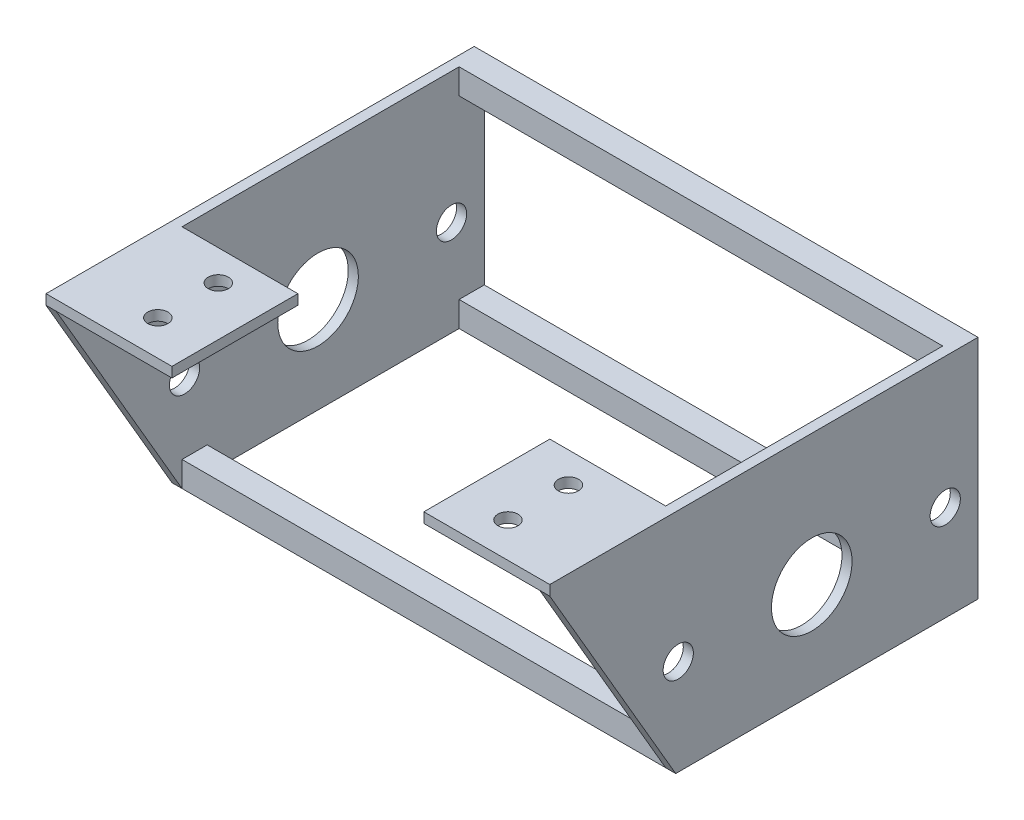
ISO-10303-21;
HEADER;
FILE_DESCRIPTION(('STEP AP214'),'2;1');
FILE_NAME('part.step','',(''),(''),'','','');
FILE_SCHEMA(('AUTOMOTIVE_DESIGN { 1 0 10303 214 1 1 1 1 }'));
ENDSEC;
DATA;
#1=APPLICATION_CONTEXT('core data for automotive mechanical design processes');
#2=APPLICATION_PROTOCOL_DEFINITION('international standard','automotive_design',2000,#1);
#3=PRODUCT_CONTEXT('',#1,'mechanical');
#4=PRODUCT('Part','Part','',(#3));
#5=PRODUCT_RELATED_PRODUCT_CATEGORY('part','',(#4));
#6=PRODUCT_DEFINITION_FORMATION('','',#4);
#7=PRODUCT_DEFINITION_CONTEXT('part definition',#1,'design');
#8=PRODUCT_DEFINITION('design','',#6,#7);
#9=PRODUCT_DEFINITION_SHAPE('','',#8);
#10=(LENGTH_UNIT() NAMED_UNIT(*) SI_UNIT(.MILLI.,.METRE.));
#11=(NAMED_UNIT(*) PLANE_ANGLE_UNIT() SI_UNIT($,.RADIAN.));
#12=(NAMED_UNIT(*) SI_UNIT($,.STERADIAN.) SOLID_ANGLE_UNIT());
#13=UNCERTAINTY_MEASURE_WITH_UNIT(LENGTH_MEASURE(1.E-05),#10,'distance_accuracy_value','');
#14=(GEOMETRIC_REPRESENTATION_CONTEXT(3) GLOBAL_UNCERTAINTY_ASSIGNED_CONTEXT((#13)) GLOBAL_UNIT_ASSIGNED_CONTEXT((#10,
#11,#12)) REPRESENTATION_CONTEXT('',''));
#15=CARTESIAN_POINT('',(0.,0.,0.));
#16=DIRECTION('',(0.,0.,1.));
#17=DIRECTION('',(1.,0.,0.));
#18=AXIS2_PLACEMENT_3D('',#15,#16,#17);
#19=CARTESIAN_POINT('',(50.,-22.5,60.));
#20=DIRECTION('',(0.,0.502620457374531,-0.864507186684193));
#21=DIRECTION('',(0.,0.864507186684193,0.502620457374531));
#22=AXIS2_PLACEMENT_3D('',#19,#20,#21);
#23=PLANE('',#22);
#24=DIRECTION('',(-1.,0.,0.));
#25=VECTOR('',#24,1.);
#26=CARTESIAN_POINT('',(50.,-22.5,60.));
#27=LINE('',#26,#25);
#28=CARTESIAN_POINT('',(-48.,-22.5,60.));
#29=VERTEX_POINT('',#28);
#30=CARTESIAN_POINT('',(-50.,-22.5,60.));
#31=VERTEX_POINT('',#30);
#32=EDGE_CURVE('E342',#29,#31,#27,.T.);
#33=ORIENTED_EDGE('',*,*,#32,.F.);
#34=DIRECTION('',(0.,0.864507186684193,0.502620457374531));
#35=VECTOR('',#34,1.);
#36=CARTESIAN_POINT('',(-48.,-22.5,60.));
#37=LINE('',#36,#35);
#38=CARTESIAN_POINT('',(-48.,20.5,85.));
#39=VERTEX_POINT('',#38);
#40=EDGE_CURVE('E300',#29,#39,#37,.T.);
#41=ORIENTED_EDGE('',*,*,#40,.T.);
#42=DIRECTION('',(-1.,0.,0.));
#43=VECTOR('',#42,1.);
#44=CARTESIAN_POINT('',(50.,20.5,85.));
#45=LINE('',#44,#43);
#46=CARTESIAN_POINT('',(-50.,20.5,85.));
#47=VERTEX_POINT('',#46);
#48=EDGE_CURVE('E346',#39,#47,#45,.T.);
#49=ORIENTED_EDGE('',*,*,#48,.T.);
#50=DIRECTION('',(0.,-0.864507186684193,-0.502620457374531));
#51=VECTOR('',#50,1.);
#52=CARTESIAN_POINT('',(-50.,-22.5,60.));
#53=LINE('',#52,#51);
#54=EDGE_CURVE('E330',#47,#31,#53,.T.);
#55=ORIENTED_EDGE('',*,*,#54,.T.);
#56=EDGE_LOOP('',(#33,#41,#49,#55));
#57=FACE_BOUND('',#56,.T.);
#58=ADVANCED_FACE('F38',(#57),#23,.F.);
#59=CARTESIAN_POINT('',(50.,20.5,85.));
#60=DIRECTION('',(0.,0.,-1.));
#61=DIRECTION('',(-1.,0.,0.));
#62=AXIS2_PLACEMENT_3D('',#59,#60,#61);
#63=PLANE('',#62);
#64=DIRECTION('',(-1.,0.,0.));
#65=VECTOR('',#64,1.);
#66=CARTESIAN_POINT('',(50.,22.5,85.));
#67=LINE('',#66,#65);
#68=CARTESIAN_POINT('',(50.,22.5,85.));
#69=VERTEX_POINT('',#68);
#70=CARTESIAN_POINT('',(25.,22.5,85.));
#71=VERTEX_POINT('',#70);
#72=EDGE_CURVE('E347',#69,#71,#67,.T.);
#73=ORIENTED_EDGE('',*,*,#72,.T.);
#74=DIRECTION('',(0.,-1.,0.));
#75=VECTOR('',#74,1.);
#76=CARTESIAN_POINT('',(25.,20.5,85.));
#77=LINE('',#76,#75);
#78=CARTESIAN_POINT('',(25.,20.5,85.));
#79=VERTEX_POINT('',#78);
#80=EDGE_CURVE('E237',#71,#79,#77,.T.);
#81=ORIENTED_EDGE('',*,*,#80,.T.);
#82=DIRECTION('',(1.,0.,0.));
#83=VECTOR('',#82,1.);
#84=CARTESIAN_POINT('',(48.,20.5,85.));
#85=LINE('',#84,#83);
#86=CARTESIAN_POINT('',(48.,20.5,85.));
#87=VERTEX_POINT('',#86);
#88=EDGE_CURVE('E240',#79,#87,#85,.T.);
#89=ORIENTED_EDGE('',*,*,#88,.T.);
#90=CARTESIAN_POINT('',(50.,20.5,85.));
#91=VERTEX_POINT('',#90);
#92=EDGE_CURVE('E343',#91,#87,#45,.T.);
#93=ORIENTED_EDGE('',*,*,#92,.F.);
#94=DIRECTION('',(0.,-1.,0.));
#95=VECTOR('',#94,1.);
#96=CARTESIAN_POINT('',(50.,20.5,85.));
#97=LINE('',#96,#95);
#98=EDGE_CURVE('E326',#69,#91,#97,.T.);
#99=ORIENTED_EDGE('',*,*,#98,.F.);
#100=EDGE_LOOP('',(#73,#81,#89,#93,#99));
#101=FACE_BOUND('',#100,.T.);
#102=ADVANCED_FACE('F400',(#101),#63,.F.);
#103=CARTESIAN_POINT('',(48.,20.5,85.));
#104=DIRECTION('',(0.,1.,0.));
#105=DIRECTION('',(0.,0.,1.));
#106=AXIS2_PLACEMENT_3D('',#103,#104,#105);
#107=PLANE('',#106);
#108=CARTESIAN_POINT('',(34.75,20.5,66.05));
#109=DIRECTION('',(0.,-1.,0.));
#110=DIRECTION('',(0.,0.,-1.));
#111=AXIS2_PLACEMENT_3D('',#108,#109,#110);
#112=CIRCLE('',#111,2.);
#113=CARTESIAN_POINT('',(34.75,20.5,64.05));
#114=VERTEX_POINT('',#113);
#115=EDGE_CURVE('E486',#114,#114,#112,.T.);
#116=ORIENTED_EDGE('',*,*,#115,.F.);
#117=EDGE_LOOP('',(#116));
#118=FACE_BOUND('',#117,.T.);
#119=CARTESIAN_POINT('',(34.75,20.5,78.05));
#120=DIRECTION('',(0.,-1.,0.));
#121=DIRECTION('',(0.,0.,-1.));
#122=AXIS2_PLACEMENT_3D('',#119,#120,#121);
#123=CIRCLE('',#122,2.);
#124=CARTESIAN_POINT('',(34.75,20.5,76.05));
#125=VERTEX_POINT('',#124);
#126=EDGE_CURVE('E489',#125,#125,#123,.T.);
#127=ORIENTED_EDGE('',*,*,#126,.F.);
#128=EDGE_LOOP('',(#127));
#129=FACE_BOUND('',#128,.T.);
#130=DIRECTION('',(0.,0.,-1.));
#131=VECTOR('',#130,1.);
#132=CARTESIAN_POINT('',(25.,20.5,85.));
#133=LINE('',#132,#131);
#134=CARTESIAN_POINT('',(25.,20.5,60.));
#135=VERTEX_POINT('',#134);
#136=EDGE_CURVE('E46',#79,#135,#133,.T.);
#137=ORIENTED_EDGE('',*,*,#136,.T.);
#138=DIRECTION('',(-1.,0.,0.));
#139=VECTOR('',#138,1.);
#140=CARTESIAN_POINT('',(48.,20.5,60.));
#141=LINE('',#140,#139);
#142=CARTESIAN_POINT('',(48.,20.5,60.));
#143=VERTEX_POINT('',#142);
#144=EDGE_CURVE('E462',#143,#135,#141,.T.);
#145=ORIENTED_EDGE('',*,*,#144,.F.);
#146=DIRECTION('',(0.,0.,-1.));
#147=VECTOR('',#146,1.);
#148=CARTESIAN_POINT('',(48.,20.5,85.));
#149=LINE('',#148,#147);
#150=EDGE_CURVE('E243',#87,#143,#149,.T.);
#151=ORIENTED_EDGE('',*,*,#150,.F.);
#152=ORIENTED_EDGE('',*,*,#88,.F.);
#153=EDGE_LOOP('',(#137,#145,#151,#152));
#154=FACE_BOUND('',#153,.T.);
#155=ADVANCED_FACE('F407',(#118,#129,#154),#107,.F.);
#156=CARTESIAN_POINT('',(-48.,-22.5,5.));
#157=DIRECTION('',(0.,0.,-1.));
#158=DIRECTION('',(-1.,0.,0.));
#159=AXIS2_PLACEMENT_3D('',#156,#157,#158);
#160=PLANE('',#159);
#161=DIRECTION('',(0.,1.,0.));
#162=VECTOR('',#161,1.);
#163=CARTESIAN_POINT('',(48.,-22.5,5.));
#164=LINE('',#163,#162);
#165=CARTESIAN_POINT('',(48.,-22.5,5.));
#166=VERTEX_POINT('',#165);
#167=CARTESIAN_POINT('',(48.,-17.5,5.));
#168=VERTEX_POINT('',#167);
#169=EDGE_CURVE('E316',#166,#168,#164,.T.);
#170=ORIENTED_EDGE('',*,*,#169,.T.);
#171=DIRECTION('',(-1.,0.,0.));
#172=VECTOR('',#171,1.);
#173=CARTESIAN_POINT('',(-48.,-17.5,5.));
#174=LINE('',#173,#172);
#175=CARTESIAN_POINT('',(-48.,-17.5,5.));
#176=VERTEX_POINT('',#175);
#177=EDGE_CURVE('E209',#168,#176,#174,.T.);
#178=ORIENTED_EDGE('',*,*,#177,.T.);
#179=DIRECTION('',(0.,1.,0.));
#180=VECTOR('',#179,1.);
#181=CARTESIAN_POINT('',(-48.,-22.5,5.));
#182=LINE('',#181,#180);
#183=CARTESIAN_POINT('',(-48.,-22.5,5.00000000000002));
#184=VERTEX_POINT('',#183);
#185=EDGE_CURVE('E311',#184,#176,#182,.T.);
#186=ORIENTED_EDGE('',*,*,#185,.F.);
#187=DIRECTION('',(-1.,0.,0.));
#188=VECTOR('',#187,1.);
#189=CARTESIAN_POINT('',(-48.,-22.5,5.));
#190=LINE('',#189,#188);
#191=EDGE_CURVE('E305',#166,#184,#190,.T.);
#192=ORIENTED_EDGE('',*,*,#191,.F.);
#193=EDGE_LOOP('',(#170,#178,#186,#192));
#194=FACE_BOUND('',#193,.T.);
#195=ADVANCED_FACE('F533',(#194),#160,.F.);
#196=CARTESIAN_POINT('',(50.,22.5,90.));
#197=DIRECTION('',(-1.,0.,0.));
#198=DIRECTION('',(0.,-1.,0.));
#199=AXIS2_PLACEMENT_3D('',#196,#197,#198);
#200=PLANE('',#199);
#201=CARTESIAN_POINT('',(50.,-3.50000000000018,59.5));
#202=DIRECTION('',(1.,0.,0.));
#203=DIRECTION('',(0.,1.,0.));
#204=AXIS2_PLACEMENT_3D('',#201,#202,#203);
#205=CIRCLE('',#204,3.);
#206=CARTESIAN_POINT('',(50.,-0.500000000000175,59.5));
#207=VERTEX_POINT('',#206);
#208=EDGE_CURVE('E246',#207,#207,#205,.T.);
#209=ORIENTED_EDGE('',*,*,#208,.F.);
#210=EDGE_LOOP('',(#209));
#211=FACE_BOUND('',#210,.T.);
#212=CARTESIAN_POINT('',(50.,-3.49999999999979,6.5));
#213=DIRECTION('',(1.,0.,0.));
#214=DIRECTION('',(0.,1.,0.));
#215=AXIS2_PLACEMENT_3D('',#212,#213,#214);
#216=CIRCLE('',#215,3.);
#217=CARTESIAN_POINT('',(50.,-0.499999999999787,6.5));
#218=VERTEX_POINT('',#217);
#219=EDGE_CURVE('E252',#218,#218,#216,.T.);
#220=ORIENTED_EDGE('',*,*,#219,.F.);
#221=EDGE_LOOP('',(#220));
#222=FACE_BOUND('',#221,.T.);
#223=CARTESIAN_POINT('',(50.,-3.49999999999998,33.));
#224=DIRECTION('',(1.,0.,0.));
#225=DIRECTION('',(0.,1.,0.));
#226=AXIS2_PLACEMENT_3D('',#223,#224,#225);
#227=CIRCLE('',#226,8.);
#228=CARTESIAN_POINT('',(50.,4.50000000000002,33.));
#229=VERTEX_POINT('',#228);
#230=EDGE_CURVE('E251',#229,#229,#227,.T.);
#231=ORIENTED_EDGE('',*,*,#230,.F.);
#232=EDGE_LOOP('',(#231));
#233=FACE_BOUND('',#232,.T.);
#234=ORIENTED_EDGE('',*,*,#98,.T.);
#235=DIRECTION('',(0.,-0.864507186684193,-0.502620457374531));
#236=VECTOR('',#235,1.);
#237=CARTESIAN_POINT('',(50.,-22.5,60.));
#238=LINE('',#237,#236);
#239=CARTESIAN_POINT('',(50.,-22.5,60.));
#240=VERTEX_POINT('',#239);
#241=EDGE_CURVE('E329',#91,#240,#238,.T.);
#242=ORIENTED_EDGE('',*,*,#241,.T.);
#243=DIRECTION('',(0.,0.,-1.));
#244=VECTOR('',#243,1.);
#245=CARTESIAN_POINT('',(50.,-22.5,90.));
#246=LINE('',#245,#244);
#247=CARTESIAN_POINT('',(50.,-22.5,0.));
#248=VERTEX_POINT('',#247);
#249=EDGE_CURVE('E361',#240,#248,#246,.T.);
#250=ORIENTED_EDGE('',*,*,#249,.T.);
#251=DIRECTION('',(0.,1.,0.));
#252=VECTOR('',#251,1.);
#253=CARTESIAN_POINT('',(50.,22.5,0.));
#254=LINE('',#253,#252);
#255=CARTESIAN_POINT('',(50.,22.5,0.));
#256=VERTEX_POINT('',#255);
#257=EDGE_CURVE('E341',#248,#256,#254,.T.);
#258=ORIENTED_EDGE('',*,*,#257,.T.);
#259=DIRECTION('',(0.,0.,-1.));
#260=VECTOR('',#259,1.);
#261=CARTESIAN_POINT('',(50.,22.5,90.));
#262=LINE('',#261,#260);
#263=EDGE_CURVE('E367',#69,#256,#262,.T.);
#264=ORIENTED_EDGE('',*,*,#263,.F.);
#265=EDGE_LOOP('',(#234,#242,#250,#258,#264));
#266=FACE_BOUND('',#265,.T.);
#267=ADVANCED_FACE('F40',(#211,#222,#233,#266),#200,.F.);
#268=CARTESIAN_POINT('',(-50.,22.5,90.));
#269=DIRECTION('',(0.,-1.,0.));
#270=DIRECTION('',(0.,0.,-1.));
#271=AXIS2_PLACEMENT_3D('',#268,#269,#270);
#272=PLANE('',#271);
#273=CARTESIAN_POINT('',(-34.75,22.5,78.05));
#274=DIRECTION('',(0.,-1.,0.));
#275=DIRECTION('',(0.,0.,-1.));
#276=AXIS2_PLACEMENT_3D('',#273,#274,#275);
#277=CIRCLE('',#276,2.);
#278=CARTESIAN_POINT('',(-34.75,22.5,76.05));
#279=VERTEX_POINT('',#278);
#280=EDGE_CURVE('E223',#279,#279,#277,.T.);
#281=ORIENTED_EDGE('',*,*,#280,.T.);
#282=EDGE_LOOP('',(#281));
#283=FACE_BOUND('',#282,.T.);
#284=CARTESIAN_POINT('',(-34.75,22.5,66.05));
#285=DIRECTION('',(0.,-1.,0.));
#286=DIRECTION('',(0.,0.,-1.));
#287=AXIS2_PLACEMENT_3D('',#284,#285,#286);
#288=CIRCLE('',#287,2.);
#289=CARTESIAN_POINT('',(-34.75,22.5,64.05));
#290=VERTEX_POINT('',#289);
#291=EDGE_CURVE('E496',#290,#290,#288,.T.);
#292=ORIENTED_EDGE('',*,*,#291,.T.);
#293=EDGE_LOOP('',(#292));
#294=FACE_BOUND('',#293,.T.);
#295=CARTESIAN_POINT('',(34.75,22.5,66.05));
#296=DIRECTION('',(0.,-1.,0.));
#297=DIRECTION('',(0.,0.,-1.));
#298=AXIS2_PLACEMENT_3D('',#295,#296,#297);
#299=CIRCLE('',#298,2.);
#300=CARTESIAN_POINT('',(34.75,22.5,64.05));
#301=VERTEX_POINT('',#300);
#302=EDGE_CURVE('E222',#301,#301,#299,.T.);
#303=ORIENTED_EDGE('',*,*,#302,.T.);
#304=EDGE_LOOP('',(#303));
#305=FACE_BOUND('',#304,.T.);
#306=CARTESIAN_POINT('',(34.75,22.5,78.05));
#307=DIRECTION('',(0.,-1.,0.));
#308=DIRECTION('',(0.,0.,-1.));
#309=AXIS2_PLACEMENT_3D('',#306,#307,#308);
#310=CIRCLE('',#309,2.);
#311=CARTESIAN_POINT('',(34.75,22.5,76.05));
#312=VERTEX_POINT('',#311);
#313=EDGE_CURVE('E220',#312,#312,#310,.T.);
#314=ORIENTED_EDGE('',*,*,#313,.T.);
#315=EDGE_LOOP('',(#314));
#316=FACE_BOUND('',#315,.T.);
#317=DIRECTION('',(-1.,0.,0.));
#318=VECTOR('',#317,1.);
#319=CARTESIAN_POINT('',(-50.,22.5,60.));
#320=LINE('',#319,#318);
#321=CARTESIAN_POINT('',(-25.,22.5,60.));
#322=VERTEX_POINT('',#321);
#323=CARTESIAN_POINT('',(-48.,22.5,60.));
#324=VERTEX_POINT('',#323);
#325=EDGE_CURVE('E195',#322,#324,#320,.T.);
#326=ORIENTED_EDGE('',*,*,#325,.T.);
#327=DIRECTION('',(0.,0.,-1.));
#328=VECTOR('',#327,1.);
#329=CARTESIAN_POINT('',(-48.,22.5,90.));
#330=LINE('',#329,#328);
#331=CARTESIAN_POINT('',(-48.,22.5,5.));
#332=VERTEX_POINT('',#331);
#333=EDGE_CURVE('E321',#324,#332,#330,.T.);
#334=ORIENTED_EDGE('',*,*,#333,.T.);
#335=DIRECTION('',(1.,0.,0.));
#336=VECTOR('',#335,1.);
#337=CARTESIAN_POINT('',(-50.,22.5,5.00000000000002));
#338=LINE('',#337,#336);
#339=CARTESIAN_POINT('',(48.,22.5,5.00000000000002));
#340=VERTEX_POINT('',#339);
#341=EDGE_CURVE('E314',#332,#340,#338,.T.);
#342=ORIENTED_EDGE('',*,*,#341,.T.);
#343=DIRECTION('',(0.,0.,1.));
#344=VECTOR('',#343,1.);
#345=CARTESIAN_POINT('',(48.,22.5,90.));
#346=LINE('',#345,#344);
#347=CARTESIAN_POINT('',(48.,22.5,60.));
#348=VERTEX_POINT('',#347);
#349=EDGE_CURVE('E323',#340,#348,#346,.T.);
#350=ORIENTED_EDGE('',*,*,#349,.T.);
#351=DIRECTION('',(-1.,0.,0.));
#352=VECTOR('',#351,1.);
#353=CARTESIAN_POINT('',(-50.,22.5,60.));
#354=LINE('',#353,#352);
#355=CARTESIAN_POINT('',(25.,22.5,60.));
#356=VERTEX_POINT('',#355);
#357=EDGE_CURVE('E455',#348,#356,#354,.T.);
#358=ORIENTED_EDGE('',*,*,#357,.T.);
#359=DIRECTION('',(0.,0.,1.));
#360=VECTOR('',#359,1.);
#361=CARTESIAN_POINT('',(25.,22.5,90.));
#362=LINE('',#361,#360);
#363=EDGE_CURVE('E231',#356,#71,#362,.T.);
#364=ORIENTED_EDGE('',*,*,#363,.T.);
#365=ORIENTED_EDGE('',*,*,#72,.F.);
#366=ORIENTED_EDGE('',*,*,#263,.T.);
#367=DIRECTION('',(-1.,0.,0.));
#368=VECTOR('',#367,1.);
#369=CARTESIAN_POINT('',(-50.,22.5,0.));
#370=LINE('',#369,#368);
#371=CARTESIAN_POINT('',(-50.,22.5,0.));
#372=VERTEX_POINT('',#371);
#373=EDGE_CURVE('E352',#256,#372,#370,.T.);
#374=ORIENTED_EDGE('',*,*,#373,.T.);
#375=DIRECTION('',(0.,0.,-1.));
#376=VECTOR('',#375,1.);
#377=CARTESIAN_POINT('',(-50.,22.5,90.));
#378=LINE('',#377,#376);
#379=CARTESIAN_POINT('',(-50.,22.5,85.));
#380=VERTEX_POINT('',#379);
#381=EDGE_CURVE('E365',#380,#372,#378,.T.);
#382=ORIENTED_EDGE('',*,*,#381,.F.);
#383=CARTESIAN_POINT('',(-25.,22.5,85.));
#384=VERTEX_POINT('',#383);
#385=EDGE_CURVE('E333',#384,#380,#67,.T.);
#386=ORIENTED_EDGE('',*,*,#385,.F.);
#387=DIRECTION('',(0.,0.,-1.));
#388=VECTOR('',#387,1.);
#389=CARTESIAN_POINT('',(-25.,22.5,90.));
#390=LINE('',#389,#388);
#391=EDGE_CURVE('E225',#384,#322,#390,.T.);
#392=ORIENTED_EDGE('',*,*,#391,.T.);
#393=EDGE_LOOP('',(#326,#334,#342,#350,#358,#364,#365,#366,#374,#382,#386,#392));
#394=FACE_BOUND('',#393,.T.);
#395=ADVANCED_FACE('F449',(#283,#294,#305,#316,#394),#272,.F.);
#396=CARTESIAN_POINT('',(-50.,22.5,90.));
#397=DIRECTION('',(1.,0.,0.));
#398=DIRECTION('',(0.,1.,0.));
#399=AXIS2_PLACEMENT_3D('',#396,#397,#398);
#400=PLANE('',#399);
#401=CARTESIAN_POINT('',(-50.,-3.50000000000019,59.5));
#402=DIRECTION('',(1.,0.,0.));
#403=DIRECTION('',(0.,1.,0.));
#404=AXIS2_PLACEMENT_3D('',#401,#402,#403);
#405=CIRCLE('',#404,3.);
#406=CARTESIAN_POINT('',(-50.,-0.500000000000188,59.5));
#407=VERTEX_POINT('',#406);
#408=EDGE_CURVE('E255',#407,#407,#405,.T.);
#409=ORIENTED_EDGE('',*,*,#408,.T.);
#410=EDGE_LOOP('',(#409));
#411=FACE_BOUND('',#410,.T.);
#412=CARTESIAN_POINT('',(-50.,-3.4999999999998,6.5));
#413=DIRECTION('',(1.,0.,0.));
#414=DIRECTION('',(0.,1.,0.));
#415=AXIS2_PLACEMENT_3D('',#412,#413,#414);
#416=CIRCLE('',#415,3.);
#417=CARTESIAN_POINT('',(-50.,-0.499999999999799,6.5));
#418=VERTEX_POINT('',#417);
#419=EDGE_CURVE('E248',#418,#418,#416,.T.);
#420=ORIENTED_EDGE('',*,*,#419,.T.);
#421=EDGE_LOOP('',(#420));
#422=FACE_BOUND('',#421,.T.);
#423=CARTESIAN_POINT('',(-50.,-3.49999999999999,33.));
#424=DIRECTION('',(1.,0.,0.));
#425=DIRECTION('',(0.,1.,0.));
#426=AXIS2_PLACEMENT_3D('',#423,#424,#425);
#427=CIRCLE('',#426,8.);
#428=CARTESIAN_POINT('',(-50.,4.50000000000001,33.));
#429=VERTEX_POINT('',#428);
#430=EDGE_CURVE('E260',#429,#429,#427,.T.);
#431=ORIENTED_EDGE('',*,*,#430,.T.);
#432=EDGE_LOOP('',(#431));
#433=FACE_BOUND('',#432,.T.);
#434=DIRECTION('',(0.,0.,-1.));
#435=VECTOR('',#434,1.);
#436=CARTESIAN_POINT('',(-50.,-22.5,90.));
#437=LINE('',#436,#435);
#438=CARTESIAN_POINT('',(-50.,-22.5,0.));
#439=VERTEX_POINT('',#438);
#440=EDGE_CURVE('E363',#31,#439,#437,.T.);
#441=ORIENTED_EDGE('',*,*,#440,.F.);
#442=ORIENTED_EDGE('',*,*,#54,.F.);
#443=DIRECTION('',(0.,-1.,0.));
#444=VECTOR('',#443,1.);
#445=CARTESIAN_POINT('',(-50.,20.5,85.));
#446=LINE('',#445,#444);
#447=EDGE_CURVE('E325',#380,#47,#446,.T.);
#448=ORIENTED_EDGE('',*,*,#447,.F.);
#449=ORIENTED_EDGE('',*,*,#381,.T.);
#450=DIRECTION('',(0.,-1.,0.));
#451=VECTOR('',#450,1.);
#452=CARTESIAN_POINT('',(-50.,22.5,0.));
#453=LINE('',#452,#451);
#454=EDGE_CURVE('E355',#372,#439,#453,.T.);
#455=ORIENTED_EDGE('',*,*,#454,.T.);
#456=EDGE_LOOP('',(#441,#442,#448,#449,#455));
#457=FACE_BOUND('',#456,.T.);
#458=ADVANCED_FACE('F548',(#411,#422,#433,#457),#400,.F.);
#459=CARTESIAN_POINT('',(-50.,-22.5,90.));
#460=DIRECTION('',(0.,1.,0.));
#461=DIRECTION('',(0.,0.,1.));
#462=AXIS2_PLACEMENT_3D('',#459,#460,#461);
#463=PLANE('',#462);
#464=DIRECTION('',(-1.,0.,0.));
#465=VECTOR('',#464,1.);
#466=CARTESIAN_POINT('',(48.,-22.5,55.));
#467=LINE('',#466,#465);
#468=CARTESIAN_POINT('',(48.,-22.5,55.));
#469=VERTEX_POINT('',#468);
#470=CARTESIAN_POINT('',(-48.,-22.5,55.));
#471=VERTEX_POINT('',#470);
#472=EDGE_CURVE('E433',#469,#471,#467,.T.);
#473=ORIENTED_EDGE('',*,*,#472,.F.);
#474=DIRECTION('',(0.,0.,-1.));
#475=VECTOR('',#474,1.);
#476=CARTESIAN_POINT('',(48.,-22.5,5.));
#477=LINE('',#476,#475);
#478=EDGE_CURVE('E302',#469,#166,#477,.T.);
#479=ORIENTED_EDGE('',*,*,#478,.T.);
#480=ORIENTED_EDGE('',*,*,#191,.T.);
#481=DIRECTION('',(0.,0.,1.));
#482=VECTOR('',#481,1.);
#483=CARTESIAN_POINT('',(-48.,-22.5,5.));
#484=LINE('',#483,#482);
#485=EDGE_CURVE('E308',#184,#471,#484,.T.);
#486=ORIENTED_EDGE('',*,*,#485,.T.);
#487=EDGE_LOOP('',(#473,#479,#480,#486));
#488=FACE_BOUND('',#487,.T.);
#489=ORIENTED_EDGE('',*,*,#249,.F.);
#490=CARTESIAN_POINT('',(48.,-22.5,60.));
#491=VERTEX_POINT('',#490);
#492=EDGE_CURVE('E338',#240,#491,#27,.T.);
#493=ORIENTED_EDGE('',*,*,#492,.T.);
#494=DIRECTION('',(1.,0.,0.));
#495=VECTOR('',#494,1.);
#496=CARTESIAN_POINT('',(-48.,-22.5,60.));
#497=LINE('',#496,#495);
#498=EDGE_CURVE('E438',#29,#491,#497,.T.);
#499=ORIENTED_EDGE('',*,*,#498,.F.);
#500=ORIENTED_EDGE('',*,*,#32,.T.);
#501=ORIENTED_EDGE('',*,*,#440,.T.);
#502=DIRECTION('',(1.,0.,0.));
#503=VECTOR('',#502,1.);
#504=CARTESIAN_POINT('',(-50.,-22.5,0.));
#505=LINE('',#504,#503);
#506=EDGE_CURVE('E358',#439,#248,#505,.T.);
#507=ORIENTED_EDGE('',*,*,#506,.T.);
#508=EDGE_LOOP('',(#489,#493,#499,#500,#501,#507));
#509=FACE_BOUND('',#508,.T.);
#510=ADVANCED_FACE('F422',(#488,#509),#463,.F.);
#511=CARTESIAN_POINT('',(0.,0.,0.));
#512=DIRECTION('',(0.,0.,1.));
#513=DIRECTION('',(1.,0.,0.));
#514=AXIS2_PLACEMENT_3D('',#511,#512,#513);
#515=PLANE('',#514);
#516=DIRECTION('',(1.,0.,0.));
#517=VECTOR('',#516,1.);
#518=CARTESIAN_POINT('',(48.,17.5,0.));
#519=LINE('',#518,#517);
#520=CARTESIAN_POINT('',(-48.,17.5,0.));
#521=VERTEX_POINT('',#520);
#522=CARTESIAN_POINT('',(48.,17.5,0.));
#523=VERTEX_POINT('',#522);
#524=EDGE_CURVE('E278',#521,#523,#519,.T.);
#525=ORIENTED_EDGE('',*,*,#524,.F.);
#526=DIRECTION('',(0.,1.,0.));
#527=VECTOR('',#526,1.);
#528=CARTESIAN_POINT('',(-48.,17.5,0.));
#529=LINE('',#528,#527);
#530=CARTESIAN_POINT('',(-48.,-17.5,0.));
#531=VERTEX_POINT('',#530);
#532=EDGE_CURVE('E276',#531,#521,#529,.T.);
#533=ORIENTED_EDGE('',*,*,#532,.F.);
#534=DIRECTION('',(-1.,0.,0.));
#535=VECTOR('',#534,1.);
#536=CARTESIAN_POINT('',(48.,-17.5,0.));
#537=LINE('',#536,#535);
#538=CARTESIAN_POINT('',(48.,-17.5,0.));
#539=VERTEX_POINT('',#538);
#540=EDGE_CURVE('E284',#539,#531,#537,.T.);
#541=ORIENTED_EDGE('',*,*,#540,.F.);
#542=DIRECTION('',(0.,-1.,0.));
#543=VECTOR('',#542,1.);
#544=CARTESIAN_POINT('',(48.,17.5,0.));
#545=LINE('',#544,#543);
#546=EDGE_CURVE('E281',#523,#539,#545,.T.);
#547=ORIENTED_EDGE('',*,*,#546,.F.);
#548=EDGE_LOOP('',(#525,#533,#541,#547));
#549=FACE_BOUND('',#548,.T.);
#550=ORIENTED_EDGE('',*,*,#257,.F.);
#551=ORIENTED_EDGE('',*,*,#506,.F.);
#552=ORIENTED_EDGE('',*,*,#454,.F.);
#553=ORIENTED_EDGE('',*,*,#373,.F.);
#554=EDGE_LOOP('',(#550,#551,#552,#553));
#555=FACE_BOUND('',#554,.T.);
#556=ADVANCED_FACE('F414',(#549,#555),#515,.F.);
#557=DIRECTION('',(0.,-0.864507186684193,-0.502620457374531));
#558=VECTOR('',#557,1.);
#559=CARTESIAN_POINT('',(48.,-22.5,60.));
#560=LINE('',#559,#558);
#561=EDGE_CURVE('E298',#87,#491,#560,.T.);
#562=ORIENTED_EDGE('',*,*,#561,.T.);
#563=ORIENTED_EDGE('',*,*,#492,.F.);
#564=ORIENTED_EDGE('',*,*,#241,.F.);
#565=ORIENTED_EDGE('',*,*,#92,.T.);
#566=EDGE_LOOP('',(#562,#563,#564,#565));
#567=FACE_BOUND('',#566,.T.);
#568=ADVANCED_FACE('F403',(#567),#23,.F.);
#569=CARTESIAN_POINT('',(-25.,20.5,85.));
#570=VERTEX_POINT('',#569);
#571=EDGE_CURVE('E241',#39,#570,#85,.T.);
#572=ORIENTED_EDGE('',*,*,#571,.T.);
#573=DIRECTION('',(0.,1.,0.));
#574=VECTOR('',#573,1.);
#575=CARTESIAN_POINT('',(-25.,20.5,85.));
#576=LINE('',#575,#574);
#577=EDGE_CURVE('E207',#570,#384,#576,.T.);
#578=ORIENTED_EDGE('',*,*,#577,.T.);
#579=ORIENTED_EDGE('',*,*,#385,.T.);
#580=ORIENTED_EDGE('',*,*,#447,.T.);
#581=ORIENTED_EDGE('',*,*,#48,.F.);
#582=EDGE_LOOP('',(#572,#578,#579,#580,#581));
#583=FACE_BOUND('',#582,.T.);
#584=ADVANCED_FACE('F410',(#583),#63,.F.);
#585=CARTESIAN_POINT('',(48.,-22.5,5.));
#586=DIRECTION('',(1.,0.,0.));
#587=DIRECTION('',(0.,0.,-1.));
#588=AXIS2_PLACEMENT_3D('',#585,#586,#587);
#589=PLANE('',#588);
#590=DIRECTION('',(0.,-1.,0.));
#591=VECTOR('',#590,1.);
#592=CARTESIAN_POINT('',(48.,54.5,60.));
#593=LINE('',#592,#591);
#594=EDGE_CURVE('E464',#348,#143,#593,.T.);
#595=ORIENTED_EDGE('',*,*,#594,.F.);
#596=ORIENTED_EDGE('',*,*,#349,.F.);
#597=CARTESIAN_POINT('',(48.,17.5,5.));
#598=VERTEX_POINT('',#597);
#599=EDGE_CURVE('E310',#598,#340,#164,.T.);
#600=ORIENTED_EDGE('',*,*,#599,.F.);
#601=DIRECTION('',(0.,0.,-1.));
#602=VECTOR('',#601,1.);
#603=CARTESIAN_POINT('',(48.,17.5,85.));
#604=LINE('',#603,#602);
#605=EDGE_CURVE('E294',#598,#523,#604,.T.);
#606=ORIENTED_EDGE('',*,*,#605,.T.);
#607=ORIENTED_EDGE('',*,*,#546,.T.);
#608=DIRECTION('',(0.,0.,-1.));
#609=VECTOR('',#608,1.);
#610=CARTESIAN_POINT('',(48.,-17.5,85.));
#611=LINE('',#610,#609);
#612=EDGE_CURVE('E292',#168,#539,#611,.T.);
#613=ORIENTED_EDGE('',*,*,#612,.F.);
#614=ORIENTED_EDGE('',*,*,#169,.F.);
#615=ORIENTED_EDGE('',*,*,#478,.F.);
#616=DIRECTION('',(0.,-1.,0.));
#617=VECTOR('',#616,1.);
#618=CARTESIAN_POINT('',(48.,22.5,55.));
#619=LINE('',#618,#617);
#620=CARTESIAN_POINT('',(48.,-17.5,55.));
#621=VERTEX_POINT('',#620);
#622=EDGE_CURVE('E476',#621,#469,#619,.T.);
#623=ORIENTED_EDGE('',*,*,#622,.F.);
#624=CARTESIAN_POINT('',(48.,-17.5,60.));
#625=VERTEX_POINT('',#624);
#626=EDGE_CURVE('E291',#625,#621,#611,.T.);
#627=ORIENTED_EDGE('',*,*,#626,.F.);
#628=DIRECTION('',(0.,-1.,0.));
#629=VECTOR('',#628,1.);
#630=CARTESIAN_POINT('',(48.,11.5,60.));
#631=LINE('',#630,#629);
#632=EDGE_CURVE('E53',#625,#491,#631,.T.);
#633=ORIENTED_EDGE('',*,*,#632,.T.);
#634=ORIENTED_EDGE('',*,*,#561,.F.);
#635=ORIENTED_EDGE('',*,*,#150,.T.);
#636=EDGE_LOOP('',(#595,#596,#600,#606,#607,#613,#614,#615,#623,#627,#633,#634,#635));
#637=FACE_BOUND('',#636,.T.);
#638=CARTESIAN_POINT('',(48.,-3.50000000000018,59.5));
#639=DIRECTION('',(1.,0.,0.));
#640=DIRECTION('',(0.,0.,-1.));
#641=AXIS2_PLACEMENT_3D('',#638,#639,#640);
#642=CIRCLE('',#641,3.);
#643=CARTESIAN_POINT('',(48.,-3.50000000000018,56.5));
#644=VERTEX_POINT('',#643);
#645=EDGE_CURVE('E273',#644,#644,#642,.T.);
#646=ORIENTED_EDGE('',*,*,#645,.T.);
#647=EDGE_LOOP('',(#646));
#648=FACE_BOUND('',#647,.T.);
#649=CARTESIAN_POINT('',(48.,-3.49999999999998,33.));
#650=DIRECTION('',(1.,0.,0.));
#651=DIRECTION('',(0.,0.,-1.));
#652=AXIS2_PLACEMENT_3D('',#649,#650,#651);
#653=CIRCLE('',#652,8.);
#654=CARTESIAN_POINT('',(48.,-3.49999999999998,25.));
#655=VERTEX_POINT('',#654);
#656=EDGE_CURVE('E266',#655,#655,#653,.T.);
#657=ORIENTED_EDGE('',*,*,#656,.T.);
#658=EDGE_LOOP('',(#657));
#659=FACE_BOUND('',#658,.T.);
#660=CARTESIAN_POINT('',(48.,-3.49999999999979,6.5));
#661=DIRECTION('',(1.,0.,0.));
#662=DIRECTION('',(0.,0.,-1.));
#663=AXIS2_PLACEMENT_3D('',#660,#661,#662);
#664=CIRCLE('',#663,3.);
#665=CARTESIAN_POINT('',(48.,-3.49999999999979,3.5));
#666=VERTEX_POINT('',#665);
#667=EDGE_CURVE('E270',#666,#666,#664,.T.);
#668=ORIENTED_EDGE('',*,*,#667,.T.);
#669=EDGE_LOOP('',(#668));
#670=FACE_BOUND('',#669,.T.);
#671=ADVANCED_FACE('F420',(#637,#648,#659,#670),#589,.F.);
#672=CARTESIAN_POINT('',(-48.,-22.5,5.));
#673=DIRECTION('',(-1.,0.,0.));
#674=DIRECTION('',(0.,0.,1.));
#675=AXIS2_PLACEMENT_3D('',#672,#673,#674);
#676=PLANE('',#675);
#677=CARTESIAN_POINT('',(-48.,17.5,5.));
#678=VERTEX_POINT('',#677);
#679=EDGE_CURVE('E315',#678,#332,#182,.T.);
#680=ORIENTED_EDGE('',*,*,#679,.T.);
#681=ORIENTED_EDGE('',*,*,#333,.F.);
#682=DIRECTION('',(0.,-1.,0.));
#683=VECTOR('',#682,1.);
#684=CARTESIAN_POINT('',(-48.,54.5,60.));
#685=LINE('',#684,#683);
#686=CARTESIAN_POINT('',(-48.,20.5,60.));
#687=VERTEX_POINT('',#686);
#688=EDGE_CURVE('E198',#324,#687,#685,.T.);
#689=ORIENTED_EDGE('',*,*,#688,.T.);
#690=DIRECTION('',(0.,0.,-1.));
#691=VECTOR('',#690,1.);
#692=CARTESIAN_POINT('',(-48.,20.5,85.));
#693=LINE('',#692,#691);
#694=EDGE_CURVE('E202',#39,#687,#693,.T.);
#695=ORIENTED_EDGE('',*,*,#694,.F.);
#696=ORIENTED_EDGE('',*,*,#40,.F.);
#697=DIRECTION('',(0.,-1.,0.));
#698=VECTOR('',#697,1.);
#699=CARTESIAN_POINT('',(-48.,11.5,60.));
#700=LINE('',#699,#698);
#701=CARTESIAN_POINT('',(-48.,-17.5,60.));
#702=VERTEX_POINT('',#701);
#703=EDGE_CURVE('E434',#702,#29,#700,.T.);
#704=ORIENTED_EDGE('',*,*,#703,.F.);
#705=DIRECTION('',(0.,0.,-1.));
#706=VECTOR('',#705,1.);
#707=CARTESIAN_POINT('',(-48.,-17.5,85.));
#708=LINE('',#707,#706);
#709=CARTESIAN_POINT('',(-48.,-17.5,55.));
#710=VERTEX_POINT('',#709);
#711=EDGE_CURVE('E290',#702,#710,#708,.T.);
#712=ORIENTED_EDGE('',*,*,#711,.T.);
#713=DIRECTION('',(0.,-1.,0.));
#714=VECTOR('',#713,1.);
#715=CARTESIAN_POINT('',(-48.,22.5,55.));
#716=LINE('',#715,#714);
#717=EDGE_CURVE('E477',#710,#471,#716,.T.);
#718=ORIENTED_EDGE('',*,*,#717,.T.);
#719=ORIENTED_EDGE('',*,*,#485,.F.);
#720=ORIENTED_EDGE('',*,*,#185,.T.);
#721=EDGE_CURVE('E288',#176,#531,#708,.T.);
#722=ORIENTED_EDGE('',*,*,#721,.T.);
#723=ORIENTED_EDGE('',*,*,#532,.T.);
#724=DIRECTION('',(0.,0.,-1.));
#725=VECTOR('',#724,1.);
#726=CARTESIAN_POINT('',(-48.,17.5,85.));
#727=LINE('',#726,#725);
#728=EDGE_CURVE('E287',#678,#521,#727,.T.);
#729=ORIENTED_EDGE('',*,*,#728,.F.);
#730=EDGE_LOOP('',(#680,#681,#689,#695,#696,#704,#712,#718,#719,#720,#722,#723,#729));
#731=FACE_BOUND('',#730,.T.);
#732=CARTESIAN_POINT('',(-48.,-3.50000000000019,59.5));
#733=DIRECTION('',(-1.,0.,0.));
#734=DIRECTION('',(0.,0.,1.));
#735=AXIS2_PLACEMENT_3D('',#732,#733,#734);
#736=CIRCLE('',#735,3.);
#737=CARTESIAN_POINT('',(-48.,-3.50000000000019,62.5));
#738=VERTEX_POINT('',#737);
#739=EDGE_CURVE('E217',#738,#738,#736,.T.);
#740=ORIENTED_EDGE('',*,*,#739,.T.);
#741=EDGE_LOOP('',(#740));
#742=FACE_BOUND('',#741,.T.);
#743=CARTESIAN_POINT('',(-48.,-3.49999999999999,33.));
#744=DIRECTION('',(-1.,0.,0.));
#745=DIRECTION('',(0.,0.,1.));
#746=AXIS2_PLACEMENT_3D('',#743,#744,#745);
#747=CIRCLE('',#746,8.);
#748=CARTESIAN_POINT('',(-48.,-3.49999999999999,41.));
#749=VERTEX_POINT('',#748);
#750=EDGE_CURVE('E263',#749,#749,#747,.T.);
#751=ORIENTED_EDGE('',*,*,#750,.T.);
#752=EDGE_LOOP('',(#751));
#753=FACE_BOUND('',#752,.T.);
#754=CARTESIAN_POINT('',(-48.,-3.4999999999998,6.5));
#755=DIRECTION('',(-1.,0.,0.));
#756=DIRECTION('',(0.,0.,1.));
#757=AXIS2_PLACEMENT_3D('',#754,#755,#756);
#758=CIRCLE('',#757,3.);
#759=CARTESIAN_POINT('',(-48.,-3.4999999999998,9.50000000000001));
#760=VERTEX_POINT('',#759);
#761=EDGE_CURVE('E269',#760,#760,#758,.T.);
#762=ORIENTED_EDGE('',*,*,#761,.T.);
#763=EDGE_LOOP('',(#762));
#764=FACE_BOUND('',#763,.T.);
#765=ADVANCED_FACE('F375',(#731,#742,#753,#764),#676,.F.);
#766=ORIENTED_EDGE('',*,*,#679,.F.);
#767=DIRECTION('',(1.,0.,0.));
#768=VECTOR('',#767,1.);
#769=CARTESIAN_POINT('',(-48.,17.5,5.));
#770=LINE('',#769,#768);
#771=EDGE_CURVE('E214',#678,#598,#770,.T.);
#772=ORIENTED_EDGE('',*,*,#771,.T.);
#773=ORIENTED_EDGE('',*,*,#599,.T.);
#774=ORIENTED_EDGE('',*,*,#341,.F.);
#775=EDGE_LOOP('',(#766,#772,#773,#774));
#776=FACE_BOUND('',#775,.T.);
#777=ADVANCED_FACE('F540',(#776),#160,.F.);
#778=CARTESIAN_POINT('',(48.,17.5,85.));
#779=DIRECTION('',(0.,1.,0.));
#780=DIRECTION('',(0.,0.,1.));
#781=AXIS2_PLACEMENT_3D('',#778,#779,#780);
#782=PLANE('',#781);
#783=ORIENTED_EDGE('',*,*,#728,.T.);
#784=ORIENTED_EDGE('',*,*,#524,.T.);
#785=ORIENTED_EDGE('',*,*,#605,.F.);
#786=ORIENTED_EDGE('',*,*,#771,.F.);
#787=EDGE_LOOP('',(#783,#784,#785,#786));
#788=FACE_BOUND('',#787,.T.);
#789=ADVANCED_FACE('F580',(#788),#782,.F.);
#790=CARTESIAN_POINT('',(48.,-17.5,85.));
#791=DIRECTION('',(0.,-1.,0.));
#792=DIRECTION('',(0.,0.,-1.));
#793=AXIS2_PLACEMENT_3D('',#790,#791,#792);
#794=PLANE('',#793);
#795=ORIENTED_EDGE('',*,*,#612,.T.);
#796=ORIENTED_EDGE('',*,*,#540,.T.);
#797=ORIENTED_EDGE('',*,*,#721,.F.);
#798=ORIENTED_EDGE('',*,*,#177,.F.);
#799=EDGE_LOOP('',(#795,#796,#797,#798));
#800=FACE_BOUND('',#799,.T.);
#801=ADVANCED_FACE('F575',(#800),#794,.F.);
#802=ORIENTED_EDGE('',*,*,#711,.F.);
#803=DIRECTION('',(1.,0.,0.));
#804=VECTOR('',#803,1.);
#805=CARTESIAN_POINT('',(48.,-17.5,60.));
#806=LINE('',#805,#804);
#807=EDGE_CURVE('E12',#702,#625,#806,.T.);
#808=ORIENTED_EDGE('',*,*,#807,.T.);
#809=ORIENTED_EDGE('',*,*,#626,.T.);
#810=DIRECTION('',(-1.,0.,0.));
#811=VECTOR('',#810,1.);
#812=CARTESIAN_POINT('',(48.,-17.5,55.));
#813=LINE('',#812,#811);
#814=EDGE_CURVE('E480',#621,#710,#813,.T.);
#815=ORIENTED_EDGE('',*,*,#814,.T.);
#816=EDGE_LOOP('',(#802,#808,#809,#815));
#817=FACE_BOUND('',#816,.T.);
#818=ADVANCED_FACE('F392',(#817),#794,.F.);
#819=CARTESIAN_POINT('',(-50.,-3.49999999999999,33.));
#820=DIRECTION('',(1.,0.,0.));
#821=DIRECTION('',(0.,1.,0.));
#822=AXIS2_PLACEMENT_3D('',#819,#820,#821);
#823=CYLINDRICAL_SURFACE('',#822,8.);
#824=ORIENTED_EDGE('',*,*,#430,.F.);
#825=EDGE_LOOP('',(#824));
#826=FACE_BOUND('',#825,.T.);
#827=ORIENTED_EDGE('',*,*,#750,.F.);
#828=EDGE_LOOP('',(#827));
#829=FACE_BOUND('',#828,.T.);
#830=ADVANCED_FACE('F380',(#826,#829),#823,.F.);
#831=CARTESIAN_POINT('',(-50.,-3.4999999999998,6.5));
#832=DIRECTION('',(1.,0.,0.));
#833=DIRECTION('',(0.,1.,0.));
#834=AXIS2_PLACEMENT_3D('',#831,#832,#833);
#835=CYLINDRICAL_SURFACE('',#834,3.);
#836=ORIENTED_EDGE('',*,*,#419,.F.);
#837=EDGE_LOOP('',(#836));
#838=FACE_BOUND('',#837,.T.);
#839=ORIENTED_EDGE('',*,*,#761,.F.);
#840=EDGE_LOOP('',(#839));
#841=FACE_BOUND('',#840,.T.);
#842=ADVANCED_FACE('F377',(#838,#841),#835,.F.);
#843=CARTESIAN_POINT('',(-50.,-3.50000000000019,59.5));
#844=DIRECTION('',(1.,0.,0.));
#845=DIRECTION('',(0.,1.,0.));
#846=AXIS2_PLACEMENT_3D('',#843,#844,#845);
#847=CYLINDRICAL_SURFACE('',#846,3.);
#848=ORIENTED_EDGE('',*,*,#408,.F.);
#849=EDGE_LOOP('',(#848));
#850=FACE_BOUND('',#849,.T.);
#851=ORIENTED_EDGE('',*,*,#739,.F.);
#852=EDGE_LOOP('',(#851));
#853=FACE_BOUND('',#852,.T.);
#854=ADVANCED_FACE('F379',(#850,#853),#847,.F.);
#855=ORIENTED_EDGE('',*,*,#230,.T.);
#856=EDGE_LOOP('',(#855));
#857=FACE_BOUND('',#856,.T.);
#858=ORIENTED_EDGE('',*,*,#656,.F.);
#859=EDGE_LOOP('',(#858));
#860=FACE_BOUND('',#859,.T.);
#861=ADVANCED_FACE('F388',(#857,#860),#823,.F.);
#862=ORIENTED_EDGE('',*,*,#219,.T.);
#863=EDGE_LOOP('',(#862));
#864=FACE_BOUND('',#863,.T.);
#865=ORIENTED_EDGE('',*,*,#667,.F.);
#866=EDGE_LOOP('',(#865));
#867=FACE_BOUND('',#866,.T.);
#868=ADVANCED_FACE('F383',(#864,#867),#835,.F.);
#869=ORIENTED_EDGE('',*,*,#208,.T.);
#870=EDGE_LOOP('',(#869));
#871=FACE_BOUND('',#870,.T.);
#872=ORIENTED_EDGE('',*,*,#645,.F.);
#873=EDGE_LOOP('',(#872));
#874=FACE_BOUND('',#873,.T.);
#875=ADVANCED_FACE('F391',(#871,#874),#847,.F.);
#876=CARTESIAN_POINT('',(-34.75,20.5,78.05));
#877=DIRECTION('',(0.,-1.,0.));
#878=DIRECTION('',(0.,0.,1.));
#879=AXIS2_PLACEMENT_3D('',#876,#877,#878);
#880=CIRCLE('',#879,2.);
#881=CARTESIAN_POINT('',(-34.75,20.5,80.05));
#882=VERTEX_POINT('',#881);
#883=EDGE_CURVE('E485',#882,#882,#880,.T.);
#884=ORIENTED_EDGE('',*,*,#883,.F.);
#885=EDGE_LOOP('',(#884));
#886=FACE_BOUND('',#885,.T.);
#887=CARTESIAN_POINT('',(-34.75,20.5,66.05));
#888=DIRECTION('',(0.,-1.,0.));
#889=DIRECTION('',(0.,0.,1.));
#890=AXIS2_PLACEMENT_3D('',#887,#888,#889);
#891=CIRCLE('',#890,2.);
#892=CARTESIAN_POINT('',(-34.75,20.5,68.05));
#893=VERTEX_POINT('',#892);
#894=EDGE_CURVE('E490',#893,#893,#891,.T.);
#895=ORIENTED_EDGE('',*,*,#894,.F.);
#896=EDGE_LOOP('',(#895));
#897=FACE_BOUND('',#896,.T.);
#898=ORIENTED_EDGE('',*,*,#694,.T.);
#899=DIRECTION('',(-1.,0.,0.));
#900=VECTOR('',#899,1.);
#901=CARTESIAN_POINT('',(-48.,20.5,60.));
#902=LINE('',#901,#900);
#903=CARTESIAN_POINT('',(-25.,20.5,60.));
#904=VERTEX_POINT('',#903);
#905=EDGE_CURVE('E192',#904,#687,#902,.T.);
#906=ORIENTED_EDGE('',*,*,#905,.F.);
#907=DIRECTION('',(0.,0.,1.));
#908=VECTOR('',#907,1.);
#909=CARTESIAN_POINT('',(-25.,20.5,85.));
#910=LINE('',#909,#908);
#911=EDGE_CURVE('E60',#904,#570,#910,.T.);
#912=ORIENTED_EDGE('',*,*,#911,.T.);
#913=ORIENTED_EDGE('',*,*,#571,.F.);
#914=EDGE_LOOP('',(#898,#906,#912,#913));
#915=FACE_BOUND('',#914,.T.);
#916=ADVANCED_FACE('F200',(#886,#897,#915),#107,.F.);
#917=CARTESIAN_POINT('',(-25.,54.5,88.8389637247518));
#918=DIRECTION('',(-1.,0.,0.));
#919=DIRECTION('',(0.,0.,1.));
#920=AXIS2_PLACEMENT_3D('',#917,#918,#919);
#921=PLANE('',#920);
#922=ORIENTED_EDGE('',*,*,#911,.F.);
#923=DIRECTION('',(0.,-1.,0.));
#924=VECTOR('',#923,1.);
#925=CARTESIAN_POINT('',(-25.,54.5,60.));
#926=LINE('',#925,#924);
#927=EDGE_CURVE('E189',#322,#904,#926,.T.);
#928=ORIENTED_EDGE('',*,*,#927,.F.);
#929=ORIENTED_EDGE('',*,*,#391,.F.);
#930=ORIENTED_EDGE('',*,*,#577,.F.);
#931=EDGE_LOOP('',(#922,#928,#929,#930));
#932=FACE_BOUND('',#931,.T.);
#933=ADVANCED_FACE('F205',(#932),#921,.F.);
#934=CARTESIAN_POINT('',(25.,54.5,88.8389637247518));
#935=DIRECTION('',(1.,0.,0.));
#936=DIRECTION('',(0.,0.,-1.));
#937=AXIS2_PLACEMENT_3D('',#934,#935,#936);
#938=PLANE('',#937);
#939=ORIENTED_EDGE('',*,*,#363,.F.);
#940=DIRECTION('',(0.,-1.,0.));
#941=VECTOR('',#940,1.);
#942=CARTESIAN_POINT('',(25.,54.5,60.));
#943=LINE('',#942,#941);
#944=EDGE_CURVE('E203',#356,#135,#943,.T.);
#945=ORIENTED_EDGE('',*,*,#944,.T.);
#946=ORIENTED_EDGE('',*,*,#136,.F.);
#947=ORIENTED_EDGE('',*,*,#80,.F.);
#948=EDGE_LOOP('',(#939,#945,#946,#947));
#949=FACE_BOUND('',#948,.T.);
#950=ADVANCED_FACE('F458',(#949),#938,.F.);
#951=CARTESIAN_POINT('',(-34.75,54.5,66.05));
#952=DIRECTION('',(0.,-1.,0.));
#953=DIRECTION('',(0.,0.,-1.));
#954=AXIS2_PLACEMENT_3D('',#951,#952,#953);
#955=CYLINDRICAL_SURFACE('',#954,2.);
#956=ORIENTED_EDGE('',*,*,#894,.T.);
#957=EDGE_LOOP('',(#956));
#958=FACE_BOUND('',#957,.T.);
#959=ORIENTED_EDGE('',*,*,#291,.F.);
#960=EDGE_LOOP('',(#959));
#961=FACE_BOUND('',#960,.T.);
#962=ADVANCED_FACE('F507',(#958,#961),#955,.F.);
#963=CARTESIAN_POINT('',(-34.75,54.5,78.05));
#964=DIRECTION('',(0.,-1.,0.));
#965=DIRECTION('',(0.,0.,-1.));
#966=AXIS2_PLACEMENT_3D('',#963,#964,#965);
#967=CYLINDRICAL_SURFACE('',#966,2.);
#968=ORIENTED_EDGE('',*,*,#883,.T.);
#969=EDGE_LOOP('',(#968));
#970=FACE_BOUND('',#969,.T.);
#971=ORIENTED_EDGE('',*,*,#280,.F.);
#972=EDGE_LOOP('',(#971));
#973=FACE_BOUND('',#972,.T.);
#974=ADVANCED_FACE('F504',(#970,#973),#967,.F.);
#975=CARTESIAN_POINT('',(34.75,54.5,78.05));
#976=DIRECTION('',(0.,-1.,0.));
#977=DIRECTION('',(0.,0.,-1.));
#978=AXIS2_PLACEMENT_3D('',#975,#976,#977);
#979=CYLINDRICAL_SURFACE('',#978,2.);
#980=ORIENTED_EDGE('',*,*,#126,.T.);
#981=EDGE_LOOP('',(#980));
#982=FACE_BOUND('',#981,.T.);
#983=ORIENTED_EDGE('',*,*,#313,.F.);
#984=EDGE_LOOP('',(#983));
#985=FACE_BOUND('',#984,.T.);
#986=ADVANCED_FACE('F506',(#982,#985),#979,.F.);
#987=CARTESIAN_POINT('',(34.75,54.5,66.05));
#988=DIRECTION('',(0.,-1.,0.));
#989=DIRECTION('',(0.,0.,-1.));
#990=AXIS2_PLACEMENT_3D('',#987,#988,#989);
#991=CYLINDRICAL_SURFACE('',#990,2.);
#992=ORIENTED_EDGE('',*,*,#115,.T.);
#993=EDGE_LOOP('',(#992));
#994=FACE_BOUND('',#993,.T.);
#995=ORIENTED_EDGE('',*,*,#302,.F.);
#996=EDGE_LOOP('',(#995));
#997=FACE_BOUND('',#996,.T.);
#998=ADVANCED_FACE('F514',(#994,#997),#991,.F.);
#999=CARTESIAN_POINT('',(48.,22.5,55.));
#1000=DIRECTION('',(0.,0.,1.));
#1001=DIRECTION('',(1.,0.,0.));
#1002=AXIS2_PLACEMENT_3D('',#999,#1000,#1001);
#1003=PLANE('',#1002);
#1004=ORIENTED_EDGE('',*,*,#622,.T.);
#1005=ORIENTED_EDGE('',*,*,#472,.T.);
#1006=ORIENTED_EDGE('',*,*,#717,.F.);
#1007=ORIENTED_EDGE('',*,*,#814,.F.);
#1008=EDGE_LOOP('',(#1004,#1005,#1006,#1007));
#1009=FACE_BOUND('',#1008,.T.);
#1010=ADVANCED_FACE('F564',(#1009),#1003,.F.);
#1011=CARTESIAN_POINT('',(-48.,11.5,60.));
#1012=DIRECTION('',(0.,0.,-1.));
#1013=DIRECTION('',(-1.,0.,0.));
#1014=AXIS2_PLACEMENT_3D('',#1011,#1012,#1013);
#1015=PLANE('',#1014);
#1016=ORIENTED_EDGE('',*,*,#703,.T.);
#1017=ORIENTED_EDGE('',*,*,#498,.T.);
#1018=ORIENTED_EDGE('',*,*,#632,.F.);
#1019=ORIENTED_EDGE('',*,*,#807,.F.);
#1020=EDGE_LOOP('',(#1016,#1017,#1018,#1019));
#1021=FACE_BOUND('',#1020,.T.);
#1022=ADVANCED_FACE('F439',(#1021),#1015,.F.);
#1023=CARTESIAN_POINT('',(-48.,54.5,60.));
#1024=DIRECTION('',(0.,0.,1.));
#1025=DIRECTION('',(1.,0.,0.));
#1026=AXIS2_PLACEMENT_3D('',#1023,#1024,#1025);
#1027=PLANE('',#1026);
#1028=ORIENTED_EDGE('',*,*,#927,.T.);
#1029=ORIENTED_EDGE('',*,*,#905,.T.);
#1030=ORIENTED_EDGE('',*,*,#688,.F.);
#1031=ORIENTED_EDGE('',*,*,#325,.F.);
#1032=EDGE_LOOP('',(#1028,#1029,#1030,#1031));
#1033=FACE_BOUND('',#1032,.T.);
#1034=ADVANCED_FACE('F190',(#1033),#1027,.F.);
#1035=CARTESIAN_POINT('',(48.,54.5,60.));
#1036=DIRECTION('',(0.,0.,1.));
#1037=DIRECTION('',(1.,0.,0.));
#1038=AXIS2_PLACEMENT_3D('',#1035,#1036,#1037);
#1039=PLANE('',#1038);
#1040=ORIENTED_EDGE('',*,*,#594,.T.);
#1041=ORIENTED_EDGE('',*,*,#144,.T.);
#1042=ORIENTED_EDGE('',*,*,#944,.F.);
#1043=ORIENTED_EDGE('',*,*,#357,.F.);
#1044=EDGE_LOOP('',(#1040,#1041,#1042,#1043));
#1045=FACE_BOUND('',#1044,.T.);
#1046=ADVANCED_FACE('F788',(#1045),#1039,.F.);
#1047=CLOSED_SHELL('',(#58,#102,#155,#195,#267,#395,#458,#510,#556,#568,#584,#671,#765,#777,
#789,#801,#818,#830,#842,#854,#861,#868,#875,#916,#933,#950,#962,#974,#986,#998,#1010,#1022,
#1034,#1046));
#1048=MANIFOLD_SOLID_BREP('B2',#1047);
#1049=ADVANCED_BREP_SHAPE_REPRESENTATION('',(#18,#1048),#14);
#1050=SHAPE_DEFINITION_REPRESENTATION(#9,#1049);
ENDSEC;
END-ISO-10303-21;
